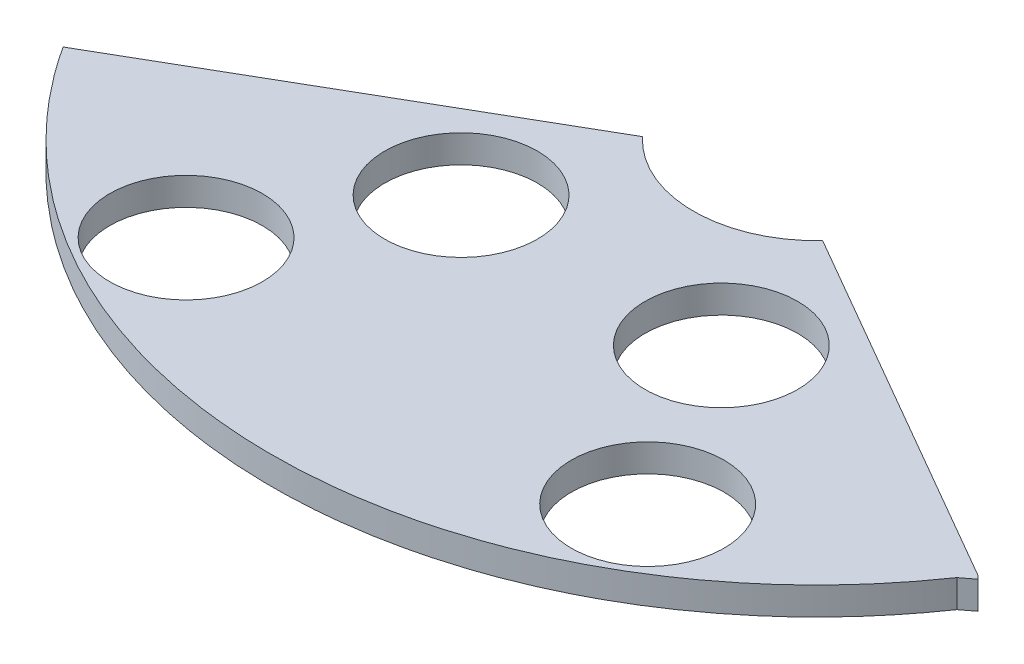
ISO-10303-21;
HEADER;
FILE_DESCRIPTION(('STEP AP214'),'2;1');
FILE_NAME('part.step','',(''),(''),'','','');
FILE_SCHEMA(('AUTOMOTIVE_DESIGN { 1 0 10303 214 1 1 1 1 }'));
ENDSEC;
DATA;
#1=APPLICATION_CONTEXT('core data for automotive mechanical design processes');
#2=APPLICATION_PROTOCOL_DEFINITION('international standard','automotive_design',2000,#1);
#3=PRODUCT_CONTEXT('',#1,'mechanical');
#4=PRODUCT('Part','Part','',(#3));
#5=PRODUCT_RELATED_PRODUCT_CATEGORY('part','',(#4));
#6=PRODUCT_DEFINITION_FORMATION('','',#4);
#7=PRODUCT_DEFINITION_CONTEXT('part definition',#1,'design');
#8=PRODUCT_DEFINITION('design','',#6,#7);
#9=PRODUCT_DEFINITION_SHAPE('','',#8);
#10=(LENGTH_UNIT() NAMED_UNIT(*) SI_UNIT(.MILLI.,.METRE.));
#11=(NAMED_UNIT(*) PLANE_ANGLE_UNIT() SI_UNIT($,.RADIAN.));
#12=(NAMED_UNIT(*) SI_UNIT($,.STERADIAN.) SOLID_ANGLE_UNIT());
#13=UNCERTAINTY_MEASURE_WITH_UNIT(LENGTH_MEASURE(1.E-05),#10,'distance_accuracy_value','');
#14=(GEOMETRIC_REPRESENTATION_CONTEXT(3) GLOBAL_UNCERTAINTY_ASSIGNED_CONTEXT((#13)) GLOBAL_UNIT_ASSIGNED_CONTEXT((#10,
#11,#12)) REPRESENTATION_CONTEXT('',''));
#15=CARTESIAN_POINT('',(0.,0.,0.));
#16=DIRECTION('',(0.,0.,1.));
#17=DIRECTION('',(1.,0.,0.));
#18=AXIS2_PLACEMENT_3D('',#15,#16,#17);
#19=CARTESIAN_POINT('',(-1.09286559018315,-19.7359999999999,78.4917186262233));
#20=DIRECTION('',(0.,-1.,0.));
#21=DIRECTION('',(0.,0.,-1.));
#22=AXIS2_PLACEMENT_3D('',#19,#20,#21);
#23=PLANE('',#22);
#24=CARTESIAN_POINT('',(18.75,-19.7359999999999,32.476));
#25=DIRECTION('',(0.,-1.,0.));
#26=DIRECTION('',(0.,0.,-1.));
#27=AXIS2_PLACEMENT_3D('',#24,#25,#26);
#28=CIRCLE('',#27,10.999845998306);
#29=CARTESIAN_POINT('',(18.75,-19.7359999999999,21.476154001694));
#30=VERTEX_POINT('',#29);
#31=EDGE_CURVE('E271',#30,#30,#28,.T.);
#32=ORIENTED_EDGE('',*,*,#31,.F.);
#33=EDGE_LOOP('',(#32));
#34=FACE_BOUND('',#33,.T.);
#35=CARTESIAN_POINT('',(-33.25,-19.7359999999999,57.591));
#36=DIRECTION('',(0.,-1.,0.));
#37=DIRECTION('',(0.,0.,-1.));
#38=AXIS2_PLACEMENT_3D('',#35,#36,#37);
#39=CIRCLE('',#38,10.999845998306);
#40=CARTESIAN_POINT('',(-33.25,-19.7359999999999,46.591154001694));
#41=VERTEX_POINT('',#40);
#42=EDGE_CURVE('E172',#41,#41,#39,.T.);
#43=ORIENTED_EDGE('',*,*,#42,.F.);
#44=EDGE_LOOP('',(#43));
#45=FACE_BOUND('',#44,.T.);
#46=CARTESIAN_POINT('',(-65.8942438215736,-19.7359999999999,42.6629141284689));
#47=CARTESIAN_POINT('',(-64.1472414305696,-19.7359999999999,45.3602520881617));
#48=CARTESIAN_POINT('',(-62.2363310502885,-19.7359999999999,47.9508406766418));
#49=CARTESIAN_POINT('',(-58.1100822816932,-19.7359999999999,52.8752452929919));
#50=CARTESIAN_POINT('',(-55.8944049303422,-19.7359999999999,55.2116482042529));
#51=CARTESIAN_POINT('',(-51.195569614386,-19.7359999999999,59.595337686235));
#52=CARTESIAN_POINT('',(-48.7121818544646,-19.7359999999999,61.6419684866191));
#53=CARTESIAN_POINT('',(-43.5114856669702,-19.7359999999999,65.416433832882));
#54=CARTESIAN_POINT('',(-40.7949636290645,-19.7359999999999,67.1443719026055));
#55=CARTESIAN_POINT('',(-32.3607894001296,-19.7359999999999,71.8080075642212));
#56=CARTESIAN_POINT('',(-26.3541013953263,-19.7359999999999,74.2232514644215));
#57=CARTESIAN_POINT('',(-17.0375684207889,-19.7359999999999,76.6957014012581));
#58=CARTESIAN_POINT('',(-13.8810239198047,-19.7359999999999,77.3294133202082));
#59=CARTESIAN_POINT('',(-7.51573904708789,-19.7359999999999,78.2050957041617));
#60=CARTESIAN_POINT('',(-4.30578875535767,-19.7359999999999,78.4468568240643));
#61=CARTESIAN_POINT('',(2.12005757499126,-19.7359999999999,78.5365804283823));
#62=CARTESIAN_POINT('',(5.33493187381434,-19.7359999999999,78.3844694163273));
#63=CARTESIAN_POINT('',(11.7220680572036,-19.7359999999999,77.6860169605038));
#64=CARTESIAN_POINT('',(14.8955490763839,-19.7359999999999,77.1405837357742));
#65=CARTESIAN_POINT('',(21.1491079485447,-19.7359999999999,75.6657937665534));
#66=CARTESIAN_POINT('',(24.2313598285916,-19.7359999999999,74.7357771150608));
#67=CARTESIAN_POINT('',(30.2580378869472,-19.7359999999999,72.5060911546451));
#68=CARTESIAN_POINT('',(33.2009075034653,-19.7359999999999,71.2065298415476));
#69=CARTESIAN_POINT('',(37.4818746165074,-19.7359999999999,68.991556247402));
#70=CARTESIAN_POINT('',(38.8873079096657,-19.7359999999999,68.209168285755));
#71=CARTESIAN_POINT('',(41.6461218418099,-19.7359999999999,66.5613968684718));
#72=CARTESIAN_POINT('',(42.9990679200304,-19.7359999999999,65.6959511055394));
#73=CARTESIAN_POINT('',(46.974955558158,-19.7359999999999,62.9750464742475));
#74=CARTESIAN_POINT('',(49.51726850279,-19.7359999999999,60.9961166995591));
#75=CARTESIAN_POINT('',(54.3364388927539,-19.7359999999999,56.7470135936365));
#76=CARTESIAN_POINT('',(56.6156980920303,-19.7359999999999,54.4735983931706));
#77=CARTESIAN_POINT('',(60.8774914331862,-19.7359999999999,49.6654317890081));
#78=CARTESIAN_POINT('',(62.8601686423583,-19.7359999999999,47.1298776527545));
#79=CARTESIAN_POINT('',(64.680653987707,-19.7359999999999,44.4823608366133));
#80=B_SPLINE_CURVE_WITH_KNOTS('',3,(#46,#47,#48,#49,#50,#51,#52,#53,#54,#55,#56,#57,#58,#59,#60,
#61,#62,#63,#64,#65,#66,#67,#68,#69,#70,#71,#72,#73,#74,#75,#76,#77,#78,#79),.UNSPECIFIED.,.F.,
.F.,(4,2,2,2,2,2,2,2,2,2,2,2,2,2,2,2,4),(1.43402610919274E-06,0.0625014340261092,
0.125001434026109,0.187501434026109,0.250001434026109,0.375001434026109,0.437501434026109,
0.500001434026109,0.562501434026109,0.625001434026109,0.687501434026109,0.750001434026108,
0.781251434026109,0.812501434026109,0.875001434026109,0.937501434026109,1.),.UNSPECIFIED.);
#81=CARTESIAN_POINT('',(64.6806539878137,-19.7359999999999,44.4823608366887));
#82=VERTEX_POINT('',#81);
#83=CARTESIAN_POINT('',(-65.8942438215736,-19.7359999999999,42.6629141284689));
#84=VERTEX_POINT('',#83);
#85=EDGE_CURVE('E130',#82,#84,#80,.F.);
#86=ORIENTED_EDGE('',*,*,#85,.T.);
#87=DIRECTION('',(0.866025113443951,0.,-0.500000502884138));
#88=VECTOR('',#87,1.);
#89=CARTESIAN_POINT('',(-65.8942438215736,-19.7359999999999,42.6629141284689));
#90=LINE('',#89,#88);
#91=CARTESIAN_POINT('',(-12.9766531358799,-19.7359999999999,12.1108879302399));
#92=VERTEX_POINT('',#91);
#93=EDGE_CURVE('E88',#84,#92,#90,.T.);
#94=ORIENTED_EDGE('',*,*,#93,.T.);
#95=CARTESIAN_POINT('',(0.,-19.7359999999999,0.));
#96=DIRECTION('',(0.,1.,0.));
#97=DIRECTION('',(0.,0.,-1.));
#98=AXIS2_PLACEMENT_3D('',#95,#96,#97);
#99=CIRCLE('',#98,17.7501305084715);
#100=CARTESIAN_POINT('',(12.9766531358511,-19.7359999999999,12.1108879302707));
#101=VERTEX_POINT('',#100);
#102=EDGE_CURVE('E101',#92,#101,#99,.T.);
#103=ORIENTED_EDGE('',*,*,#102,.T.);
#104=DIRECTION('',(0.866025113442762,0.,0.500000502886197));
#105=VECTOR('',#104,1.);
#106=CARTESIAN_POINT('',(12.9766531358511,-19.7359999999999,12.1108879302707));
#107=LINE('',#106,#105);
#108=CARTESIAN_POINT('',(65.8946490574716,-19.7359999999999,42.6631480920527));
#109=VERTEX_POINT('',#108);
#110=EDGE_CURVE('E95',#101,#109,#107,.T.);
#111=ORIENTED_EDGE('',*,*,#110,.T.);
#112=DIRECTION('',(0.716228360357051,0.,0.697865987006281));
#113=VECTOR('',#112,1.);
#114=CARTESIAN_POINT('',(65.8946490574716,-19.7359999999999,42.6631480920527));
#115=LINE('',#114,#113);
#116=CARTESIAN_POINT('',(66.4056552017174,-19.7359999999999,43.1610532672158));
#117=VERTEX_POINT('',#116);
#118=EDGE_CURVE('E99',#109,#117,#115,.T.);
#119=ORIENTED_EDGE('',*,*,#118,.T.);
#120=DIRECTION('',(-0.793871471282829,0.,0.608085591905643));
#121=VECTOR('',#120,1.);
#122=CARTESIAN_POINT('',(66.4056552017174,-19.7359999999999,43.1610532672158));
#123=LINE('',#122,#121);
#124=EDGE_CURVE('E51',#117,#82,#123,.T.);
#125=ORIENTED_EDGE('',*,*,#124,.T.);
#126=EDGE_LOOP('',(#86,#94,#103,#111,#119,#125));
#127=FACE_BOUND('',#126,.T.);
#128=CARTESIAN_POINT('',(33.25,-19.7359999999999,57.591));
#129=DIRECTION('',(0.,-1.,0.));
#130=DIRECTION('',(0.,0.,-1.));
#131=AXIS2_PLACEMENT_3D('',#128,#129,#130);
#132=CIRCLE('',#131,10.999845998306);
#133=CARTESIAN_POINT('',(33.25,-19.7359999999999,46.591154001694));
#134=VERTEX_POINT('',#133);
#135=EDGE_CURVE('E181',#134,#134,#132,.T.);
#136=ORIENTED_EDGE('',*,*,#135,.F.);
#137=EDGE_LOOP('',(#136));
#138=FACE_BOUND('',#137,.T.);
#139=CARTESIAN_POINT('',(-18.75,-19.7359999999999,32.476));
#140=DIRECTION('',(0.,-1.,0.));
#141=DIRECTION('',(0.,0.,-1.));
#142=AXIS2_PLACEMENT_3D('',#139,#140,#141);
#143=CIRCLE('',#142,10.999845998306);
#144=CARTESIAN_POINT('',(-18.75,-19.7359999999999,21.476154001694));
#145=VERTEX_POINT('',#144);
#146=EDGE_CURVE('E262',#145,#145,#143,.T.);
#147=ORIENTED_EDGE('',*,*,#146,.F.);
#148=EDGE_LOOP('',(#147));
#149=FACE_BOUND('',#148,.T.);
#150=ADVANCED_FACE('F30',(#34,#45,#127,#138,#149),#23,.T.);
#151=CARTESIAN_POINT('',(-1.09286559018315,-15.7359999999999,78.4917186262233));
#152=DIRECTION('',(0.,-1.,0.));
#153=DIRECTION('',(0.,0.,-1.));
#154=AXIS2_PLACEMENT_3D('',#151,#152,#153);
#155=PLANE('',#154);
#156=CARTESIAN_POINT('',(18.75,-15.7359999999999,32.476));
#157=DIRECTION('',(0.,-1.,0.));
#158=DIRECTION('',(0.,0.,-1.));
#159=AXIS2_PLACEMENT_3D('',#156,#157,#158);
#160=CIRCLE('',#159,10.999845998306);
#161=CARTESIAN_POINT('',(18.75,-15.7359999999999,21.476154001694));
#162=VERTEX_POINT('',#161);
#163=EDGE_CURVE('E268',#162,#162,#160,.T.);
#164=ORIENTED_EDGE('',*,*,#163,.T.);
#165=EDGE_LOOP('',(#164));
#166=FACE_BOUND('',#165,.T.);
#167=CARTESIAN_POINT('',(-33.25,-15.7359999999999,57.591));
#168=DIRECTION('',(0.,-1.,0.));
#169=DIRECTION('',(0.,0.,-1.));
#170=AXIS2_PLACEMENT_3D('',#167,#168,#169);
#171=CIRCLE('',#170,10.999845998306);
#172=CARTESIAN_POINT('',(-33.25,-15.7359999999999,46.591154001694));
#173=VERTEX_POINT('',#172);
#174=EDGE_CURVE('E176',#173,#173,#171,.T.);
#175=ORIENTED_EDGE('',*,*,#174,.T.);
#176=EDGE_LOOP('',(#175));
#177=FACE_BOUND('',#176,.T.);
#178=CARTESIAN_POINT('',(64.6807793002548,-15.7359999999999,44.4821785950596));
#179=CARTESIAN_POINT('',(62.8602596271162,-15.7359999999999,47.1297612963889));
#180=CARTESIAN_POINT('',(60.8775403259305,-15.7359999999999,49.6653766280837));
#181=CARTESIAN_POINT('',(56.6156980920303,-15.7359999999999,54.4735983931706));
#182=CARTESIAN_POINT('',(54.3364388927539,-15.7359999999999,56.7470135936365));
#183=CARTESIAN_POINT('',(49.51726850279,-15.7359999999999,60.9961166995591));
#184=CARTESIAN_POINT('',(46.974955558158,-15.7359999999999,62.9750464742475));
#185=CARTESIAN_POINT('',(42.9990679200304,-15.7359999999999,65.6959511055394));
#186=CARTESIAN_POINT('',(41.6461218418099,-15.7359999999999,66.5613968684718));
#187=CARTESIAN_POINT('',(38.8873079096657,-15.7359999999999,68.209168285755));
#188=CARTESIAN_POINT('',(37.4818746165074,-15.7359999999999,68.991556247402));
#189=CARTESIAN_POINT('',(33.2009075034653,-15.7359999999999,71.2065298415476));
#190=CARTESIAN_POINT('',(30.2580378869472,-15.7359999999999,72.5060911546451));
#191=CARTESIAN_POINT('',(24.2313598285916,-15.7359999999999,74.7357771150608));
#192=CARTESIAN_POINT('',(21.1491079485447,-15.7359999999999,75.6657937665534));
#193=CARTESIAN_POINT('',(14.8955490763839,-15.7359999999999,77.1405837357742));
#194=CARTESIAN_POINT('',(11.7220680572036,-15.7359999999999,77.6860169605038));
#195=CARTESIAN_POINT('',(5.33493187381434,-15.7359999999999,78.3844694163273));
#196=CARTESIAN_POINT('',(2.12005757499126,-15.7359999999999,78.5365804283823));
#197=CARTESIAN_POINT('',(-4.30578875535767,-15.7359999999999,78.4468568240643));
#198=CARTESIAN_POINT('',(-7.51573904708789,-15.7359999999999,78.2050957041617));
#199=CARTESIAN_POINT('',(-13.8810239198047,-15.7359999999999,77.3294133202082));
#200=CARTESIAN_POINT('',(-17.0375684207889,-15.7359999999999,76.6957014012581));
#201=CARTESIAN_POINT('',(-26.3541013953263,-15.7359999999999,74.2232514644215));
#202=CARTESIAN_POINT('',(-32.3607894001296,-15.7359999999999,71.8080075642212));
#203=CARTESIAN_POINT('',(-40.7949636290645,-15.7359999999999,67.1443719026055));
#204=CARTESIAN_POINT('',(-43.5114856669702,-15.7359999999999,65.416433832882));
#205=CARTESIAN_POINT('',(-48.7121818544646,-15.7359999999999,61.6419684866191));
#206=CARTESIAN_POINT('',(-51.195569614386,-15.7359999999999,59.595337686235));
#207=CARTESIAN_POINT('',(-55.8944049303422,-15.7359999999999,55.2116482042529));
#208=CARTESIAN_POINT('',(-58.1100822816932,-15.7359999999999,52.8752452929919));
#209=CARTESIAN_POINT('',(-62.2363310502885,-15.7359999999999,47.9508406766418));
#210=CARTESIAN_POINT('',(-64.1472414305696,-15.7359999999999,45.3602520881617));
#211=CARTESIAN_POINT('',(-65.8942438215736,-15.7359999999999,42.6629141284689));
#212=B_SPLINE_CURVE_WITH_KNOTS('',3,(#178,#179,#180,#181,#182,#183,#184,#185,#186,#187,#188,
#189,#190,#191,#192,#193,#194,#195,#196,#197,#198,#199,#200,#201,#202,#203,#204,#205,#206,#207,
#208,#209,#210,#211),.UNSPECIFIED.,.F.,.F.,(4,2,2,2,2,2,2,2,2,2,2,2,2,2,2,2,4),(0.,
0.0625000000000002,0.125,0.187500000000001,0.218750000000001,0.250000000000001,
0.312500000000001,0.375000000000001,0.4375,0.5,0.5625,0.625,0.75,0.8125,0.875,0.9375,1.),.UNSPECIFIED.);
#213=CARTESIAN_POINT('',(64.6806539878137,-15.7359999999999,44.4823608366887));
#214=VERTEX_POINT('',#213);
#215=CARTESIAN_POINT('',(-65.8942438215736,-15.7359999999999,42.6629141284689));
#216=VERTEX_POINT('',#215);
#217=EDGE_CURVE('E170',#214,#216,#212,.T.);
#218=ORIENTED_EDGE('',*,*,#217,.F.);
#219=DIRECTION('',(-0.793871471282829,0.,0.608085591905643));
#220=VECTOR('',#219,1.);
#221=CARTESIAN_POINT('',(66.4056552017174,-15.7359999999999,43.1610532672158));
#222=LINE('',#221,#220);
#223=CARTESIAN_POINT('',(66.4056552017174,-15.7359999999999,43.1610532672158));
#224=VERTEX_POINT('',#223);
#225=EDGE_CURVE('E80',#224,#214,#222,.T.);
#226=ORIENTED_EDGE('',*,*,#225,.F.);
#227=DIRECTION('',(0.716228360357051,0.,0.697865987006281));
#228=VECTOR('',#227,1.);
#229=CARTESIAN_POINT('',(65.8946490574716,-15.7359999999999,42.6631480920527));
#230=LINE('',#229,#228);
#231=CARTESIAN_POINT('',(65.8946490574716,-15.7359999999999,42.6631480920527));
#232=VERTEX_POINT('',#231);
#233=EDGE_CURVE('E74',#232,#224,#230,.T.);
#234=ORIENTED_EDGE('',*,*,#233,.F.);
#235=DIRECTION('',(0.866025113442762,0.,0.500000502886197));
#236=VECTOR('',#235,1.);
#237=CARTESIAN_POINT('',(12.9766531358511,-15.7359999999999,12.1108879302707));
#238=LINE('',#237,#236);
#239=CARTESIAN_POINT('',(12.9766531358511,-15.7359999999999,12.1108879302707));
#240=VERTEX_POINT('',#239);
#241=EDGE_CURVE('E109',#240,#232,#238,.T.);
#242=ORIENTED_EDGE('',*,*,#241,.F.);
#243=CARTESIAN_POINT('',(0.,-15.7359999999999,0.));
#244=DIRECTION('',(0.,1.,0.));
#245=DIRECTION('',(0.,0.,-1.));
#246=AXIS2_PLACEMENT_3D('',#243,#244,#245);
#247=CIRCLE('',#246,17.7501305084715);
#248=CARTESIAN_POINT('',(-12.9766531358799,-15.7359999999999,12.1108879302399));
#249=VERTEX_POINT('',#248);
#250=EDGE_CURVE('E119',#249,#240,#247,.T.);
#251=ORIENTED_EDGE('',*,*,#250,.F.);
#252=DIRECTION('',(0.866025113443951,0.,-0.500000502884138));
#253=VECTOR('',#252,1.);
#254=CARTESIAN_POINT('',(-65.8942438215736,-15.7359999999999,42.6629141284689));
#255=LINE('',#254,#253);
#256=EDGE_CURVE('E121',#216,#249,#255,.T.);
#257=ORIENTED_EDGE('',*,*,#256,.F.);
#258=EDGE_LOOP('',(#218,#226,#234,#242,#251,#257));
#259=FACE_BOUND('',#258,.T.);
#260=CARTESIAN_POINT('',(33.25,-15.7359999999999,57.591));
#261=DIRECTION('',(0.,-1.,0.));
#262=DIRECTION('',(0.,0.,-1.));
#263=AXIS2_PLACEMENT_3D('',#260,#261,#262);
#264=CIRCLE('',#263,10.999845998306);
#265=CARTESIAN_POINT('',(33.25,-15.7359999999999,46.591154001694));
#266=VERTEX_POINT('',#265);
#267=EDGE_CURVE('E184',#266,#266,#264,.T.);
#268=ORIENTED_EDGE('',*,*,#267,.T.);
#269=EDGE_LOOP('',(#268));
#270=FACE_BOUND('',#269,.T.);
#271=CARTESIAN_POINT('',(-18.75,-15.7359999999999,32.476));
#272=DIRECTION('',(0.,-1.,0.));
#273=DIRECTION('',(0.,0.,-1.));
#274=AXIS2_PLACEMENT_3D('',#271,#272,#273);
#275=CIRCLE('',#274,10.999845998306);
#276=CARTESIAN_POINT('',(-18.75,-15.7359999999999,21.476154001694));
#277=VERTEX_POINT('',#276);
#278=EDGE_CURVE('E265',#277,#277,#275,.T.);
#279=ORIENTED_EDGE('',*,*,#278,.T.);
#280=EDGE_LOOP('',(#279));
#281=FACE_BOUND('',#280,.T.);
#282=ADVANCED_FACE('F146',(#166,#177,#259,#270,#281),#155,.F.);
#283=CARTESIAN_POINT('',(64.6807793002548,-19.7359999999999,44.4821785950596));
#284=CARTESIAN_POINT('',(62.8602596271162,-19.7359999999999,47.1297612963889));
#285=CARTESIAN_POINT('',(60.8775403259305,-19.7359999999999,49.6653766280837));
#286=CARTESIAN_POINT('',(56.6156980920303,-19.7359999999999,54.4735983931706));
#287=CARTESIAN_POINT('',(54.3364388927539,-19.7359999999999,56.7470135936365));
#288=CARTESIAN_POINT('',(49.51726850279,-19.7359999999999,60.9961166995591));
#289=CARTESIAN_POINT('',(46.974955558158,-19.7359999999999,62.9750464742475));
#290=CARTESIAN_POINT('',(42.9990679200304,-19.7359999999999,65.6959511055394));
#291=CARTESIAN_POINT('',(41.6461218418099,-19.7359999999999,66.5613968684718));
#292=CARTESIAN_POINT('',(38.8873079096657,-19.7359999999999,68.209168285755));
#293=CARTESIAN_POINT('',(37.4818746165074,-19.7359999999999,68.991556247402));
#294=CARTESIAN_POINT('',(33.2009075034653,-19.7359999999999,71.2065298415476));
#295=CARTESIAN_POINT('',(30.2580378869472,-19.7359999999999,72.5060911546451));
#296=CARTESIAN_POINT('',(24.2313598285916,-19.7359999999999,74.7357771150608));
#297=CARTESIAN_POINT('',(21.1491079485447,-19.7359999999999,75.6657937665534));
#298=CARTESIAN_POINT('',(14.8955490763839,-19.7359999999999,77.1405837357742));
#299=CARTESIAN_POINT('',(11.7220680572036,-19.7359999999999,77.6860169605038));
#300=CARTESIAN_POINT('',(5.33493187381434,-19.7359999999999,78.3844694163273));
#301=CARTESIAN_POINT('',(2.12005757499126,-19.7359999999999,78.5365804283823));
#302=CARTESIAN_POINT('',(-4.30578875535767,-19.7359999999999,78.4468568240643));
#303=CARTESIAN_POINT('',(-7.51573904708789,-19.7359999999999,78.2050957041617));
#304=CARTESIAN_POINT('',(-13.8810239198047,-19.7359999999999,77.3294133202082));
#305=CARTESIAN_POINT('',(-17.0375684207889,-19.7359999999999,76.6957014012581));
#306=CARTESIAN_POINT('',(-26.3541013953263,-19.7359999999999,74.2232514644215));
#307=CARTESIAN_POINT('',(-32.3607894001296,-19.7359999999999,71.8080075642212));
#308=CARTESIAN_POINT('',(-40.7949636290645,-19.7359999999999,67.1443719026055));
#309=CARTESIAN_POINT('',(-43.5114856669702,-19.7359999999999,65.416433832882));
#310=CARTESIAN_POINT('',(-48.7121818544646,-19.7359999999999,61.6419684866191));
#311=CARTESIAN_POINT('',(-51.195569614386,-19.7359999999999,59.595337686235));
#312=CARTESIAN_POINT('',(-55.8944049303422,-19.7359999999999,55.2116482042529));
#313=CARTESIAN_POINT('',(-58.1100822816932,-19.7359999999999,52.8752452929919));
#314=CARTESIAN_POINT('',(-62.2363310502885,-19.7359999999999,47.9508406766418));
#315=CARTESIAN_POINT('',(-64.1472414305696,-19.7359999999999,45.3602520881617));
#316=CARTESIAN_POINT('',(-65.8942438215736,-19.7359999999999,42.6629141284689));
#317=B_SPLINE_CURVE_WITH_KNOTS('',3,(#283,#284,#285,#286,#287,#288,#289,#290,#291,#292,#293,
#294,#295,#296,#297,#298,#299,#300,#301,#302,#303,#304,#305,#306,#307,#308,#309,#310,#311,#312,
#313,#314,#315,#316),.UNSPECIFIED.,.F.,.F.,(4,2,2,2,2,2,2,2,2,2,2,2,2,2,2,2,4),(0.,
0.0625000000000002,0.125,0.187500000000001,0.218750000000001,0.250000000000001,
0.312500000000001,0.375000000000001,0.4375,0.5,0.5625,0.625,0.75,0.8125,0.875,0.9375,1.),.UNSPECIFIED.);
#318=DIRECTION('',(0.,1.,0.));
#319=VECTOR('',#318,1.);
#320=SURFACE_OF_LINEAR_EXTRUSION('',#317,#319);
#321=ORIENTED_EDGE('',*,*,#217,.T.);
#322=DIRECTION('',(0.,1.,0.));
#323=VECTOR('',#322,1.);
#324=CARTESIAN_POINT('',(-65.8942438215736,-19.7359999999999,42.6629141284689));
#325=LINE('',#324,#323);
#326=EDGE_CURVE('E11',#84,#216,#325,.T.);
#327=ORIENTED_EDGE('',*,*,#326,.F.);
#328=ORIENTED_EDGE('',*,*,#85,.F.);
#329=DIRECTION('',(0.,1.,0.));
#330=VECTOR('',#329,1.);
#331=CARTESIAN_POINT('',(64.6806539878137,-19.7359999999999,44.4823608366887));
#332=LINE('',#331,#330);
#333=EDGE_CURVE('E115',#82,#214,#332,.T.);
#334=ORIENTED_EDGE('',*,*,#333,.T.);
#335=EDGE_LOOP('',(#321,#327,#328,#334));
#336=FACE_BOUND('',#335,.T.);
#337=ADVANCED_FACE('F32',(#336),#320,.F.);
#338=CARTESIAN_POINT('',(-65.8942438215736,-19.7359999999999,42.6629141284689));
#339=DIRECTION('',(0.500000502884138,0.,0.866025113443951));
#340=DIRECTION('',(0.866025113443951,0.,-0.500000502884138));
#341=AXIS2_PLACEMENT_3D('',#338,#339,#340);
#342=PLANE('',#341);
#343=ORIENTED_EDGE('',*,*,#256,.T.);
#344=DIRECTION('',(0.,1.,0.));
#345=VECTOR('',#344,1.);
#346=CARTESIAN_POINT('',(-12.9766531358799,-19.7359999999999,12.1108879302399));
#347=LINE('',#346,#345);
#348=EDGE_CURVE('E42',#92,#249,#347,.T.);
#349=ORIENTED_EDGE('',*,*,#348,.F.);
#350=ORIENTED_EDGE('',*,*,#93,.F.);
#351=ORIENTED_EDGE('',*,*,#326,.T.);
#352=EDGE_LOOP('',(#343,#349,#350,#351));
#353=FACE_BOUND('',#352,.T.);
#354=ADVANCED_FACE('F219',(#353),#342,.F.);
#355=CARTESIAN_POINT('',(0.,-19.7359999999999,0.));
#356=DIRECTION('',(0.,1.,0.));
#357=DIRECTION('',(0.,0.,1.));
#358=AXIS2_PLACEMENT_3D('',#355,#356,#357);
#359=CYLINDRICAL_SURFACE('',#358,17.7501305084715);
#360=ORIENTED_EDGE('',*,*,#250,.T.);
#361=DIRECTION('',(0.,1.,0.));
#362=VECTOR('',#361,1.);
#363=CARTESIAN_POINT('',(12.9766531358511,-19.7359999999999,12.1108879302707));
#364=LINE('',#363,#362);
#365=EDGE_CURVE('E110',#101,#240,#364,.T.);
#366=ORIENTED_EDGE('',*,*,#365,.F.);
#367=ORIENTED_EDGE('',*,*,#102,.F.);
#368=ORIENTED_EDGE('',*,*,#348,.T.);
#369=EDGE_LOOP('',(#360,#366,#367,#368));
#370=FACE_BOUND('',#369,.T.);
#371=ADVANCED_FACE('F221',(#370),#359,.F.);
#372=CARTESIAN_POINT('',(12.9766531358511,-19.7359999999999,12.1108879302707));
#373=DIRECTION('',(-0.500000502886198,0.,0.866025113442763));
#374=DIRECTION('',(0.866025113442763,0.,0.500000502886198));
#375=AXIS2_PLACEMENT_3D('',#372,#373,#374);
#376=PLANE('',#375);
#377=ORIENTED_EDGE('',*,*,#241,.T.);
#378=DIRECTION('',(0.,1.,0.));
#379=VECTOR('',#378,1.);
#380=CARTESIAN_POINT('',(65.8946490574716,-19.7359999999999,42.6631480920527));
#381=LINE('',#380,#379);
#382=EDGE_CURVE('E106',#109,#232,#381,.T.);
#383=ORIENTED_EDGE('',*,*,#382,.F.);
#384=ORIENTED_EDGE('',*,*,#110,.F.);
#385=ORIENTED_EDGE('',*,*,#365,.T.);
#386=EDGE_LOOP('',(#377,#383,#384,#385));
#387=FACE_BOUND('',#386,.T.);
#388=ADVANCED_FACE('F107',(#387),#376,.F.);
#389=CARTESIAN_POINT('',(65.8946490574716,-19.7359999999999,42.6631480920527));
#390=DIRECTION('',(-0.697865987006281,0.,0.716228360357051));
#391=DIRECTION('',(0.716228360357051,0.,0.697865987006281));
#392=AXIS2_PLACEMENT_3D('',#389,#390,#391);
#393=PLANE('',#392);
#394=ORIENTED_EDGE('',*,*,#233,.T.);
#395=DIRECTION('',(0.,1.,0.));
#396=VECTOR('',#395,1.);
#397=CARTESIAN_POINT('',(66.4056552017174,-19.7359999999999,43.1610532672158));
#398=LINE('',#397,#396);
#399=EDGE_CURVE('E111',#117,#224,#398,.T.);
#400=ORIENTED_EDGE('',*,*,#399,.F.);
#401=ORIENTED_EDGE('',*,*,#118,.F.);
#402=ORIENTED_EDGE('',*,*,#382,.T.);
#403=EDGE_LOOP('',(#394,#400,#401,#402));
#404=FACE_BOUND('',#403,.T.);
#405=ADVANCED_FACE('F113',(#404),#393,.F.);
#406=CARTESIAN_POINT('',(66.4056552017174,-19.7359999999999,43.1610532672158));
#407=DIRECTION('',(-0.608085591905643,0.,-0.793871471282829));
#408=DIRECTION('',(-0.793871471282829,0.,0.608085591905643));
#409=AXIS2_PLACEMENT_3D('',#406,#407,#408);
#410=PLANE('',#409);
#411=ORIENTED_EDGE('',*,*,#225,.T.);
#412=ORIENTED_EDGE('',*,*,#333,.F.);
#413=ORIENTED_EDGE('',*,*,#124,.F.);
#414=ORIENTED_EDGE('',*,*,#399,.T.);
#415=EDGE_LOOP('',(#411,#412,#413,#414));
#416=FACE_BOUND('',#415,.T.);
#417=ADVANCED_FACE('F154',(#416),#410,.F.);
#418=CARTESIAN_POINT('',(-33.25,-19.7359999999999,57.591));
#419=DIRECTION('',(0.,1.,0.));
#420=DIRECTION('',(0.,0.,1.));
#421=AXIS2_PLACEMENT_3D('',#418,#419,#420);
#422=CYLINDRICAL_SURFACE('',#421,10.999845998306);
#423=ORIENTED_EDGE('',*,*,#42,.T.);
#424=EDGE_LOOP('',(#423));
#425=FACE_BOUND('',#424,.T.);
#426=ORIENTED_EDGE('',*,*,#174,.F.);
#427=EDGE_LOOP('',(#426));
#428=FACE_BOUND('',#427,.T.);
#429=ADVANCED_FACE('F148',(#425,#428),#422,.F.);
#430=CARTESIAN_POINT('',(33.25,-19.7359999999999,57.591));
#431=DIRECTION('',(0.,1.,0.));
#432=DIRECTION('',(0.,0.,1.));
#433=AXIS2_PLACEMENT_3D('',#430,#431,#432);
#434=CYLINDRICAL_SURFACE('',#433,10.999845998306);
#435=ORIENTED_EDGE('',*,*,#135,.T.);
#436=EDGE_LOOP('',(#435));
#437=FACE_BOUND('',#436,.T.);
#438=ORIENTED_EDGE('',*,*,#267,.F.);
#439=EDGE_LOOP('',(#438));
#440=FACE_BOUND('',#439,.T.);
#441=ADVANCED_FACE('F237',(#437,#440),#434,.F.);
#442=CARTESIAN_POINT('',(18.75,-19.7359999999999,32.476));
#443=DIRECTION('',(0.,1.,0.));
#444=DIRECTION('',(0.,0.,1.));
#445=AXIS2_PLACEMENT_3D('',#442,#443,#444);
#446=CYLINDRICAL_SURFACE('',#445,10.999845998306);
#447=ORIENTED_EDGE('',*,*,#31,.T.);
#448=EDGE_LOOP('',(#447));
#449=FACE_BOUND('',#448,.T.);
#450=ORIENTED_EDGE('',*,*,#163,.F.);
#451=EDGE_LOOP('',(#450));
#452=FACE_BOUND('',#451,.T.);
#453=ADVANCED_FACE('F241',(#449,#452),#446,.F.);
#454=CARTESIAN_POINT('',(-18.75,-19.7359999999999,32.476));
#455=DIRECTION('',(0.,1.,0.));
#456=DIRECTION('',(0.,0.,1.));
#457=AXIS2_PLACEMENT_3D('',#454,#455,#456);
#458=CYLINDRICAL_SURFACE('',#457,10.999845998306);
#459=ORIENTED_EDGE('',*,*,#146,.T.);
#460=EDGE_LOOP('',(#459));
#461=FACE_BOUND('',#460,.T.);
#462=ORIENTED_EDGE('',*,*,#278,.F.);
#463=EDGE_LOOP('',(#462));
#464=FACE_BOUND('',#463,.T.);
#465=ADVANCED_FACE('F249',(#461,#464),#458,.F.);
#466=CLOSED_SHELL('',(#150,#282,#337,#354,#371,#388,#405,#417,#429,#441,#453,#465));
#467=MANIFOLD_SOLID_BREP('B2',#466);
#468=ADVANCED_BREP_SHAPE_REPRESENTATION('',(#18,#467),#14);
#469=SHAPE_DEFINITION_REPRESENTATION(#9,#468);
ENDSEC;
END-ISO-10303-21;
